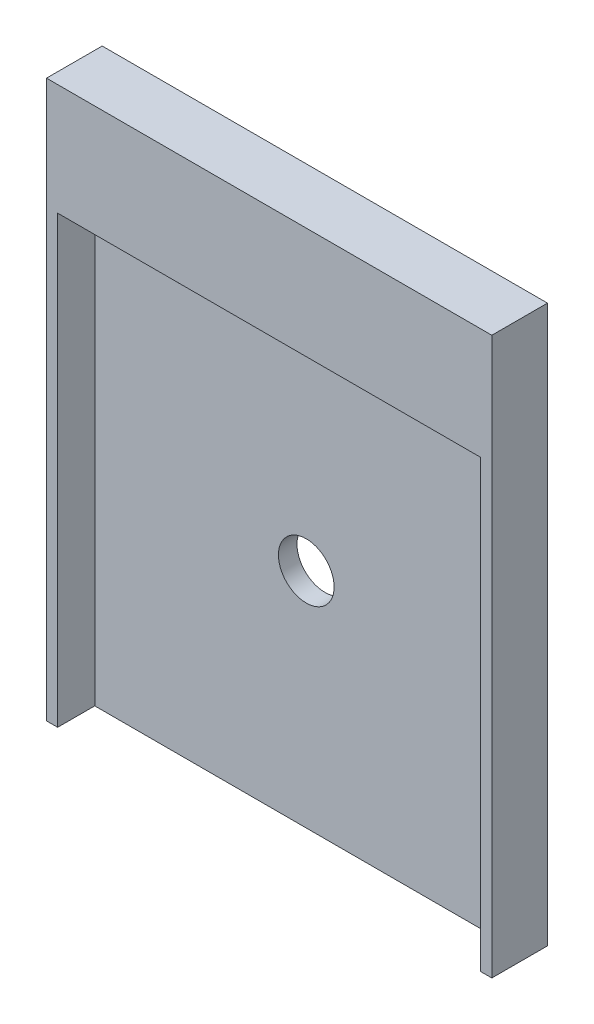
ISO-10303-21;
HEADER;
FILE_DESCRIPTION(('STEP AP214'),'2;1');
FILE_NAME('part.step','',(''),(''),'','','');
FILE_SCHEMA(('AUTOMOTIVE_DESIGN { 1 0 10303 214 1 1 1 1 }'));
ENDSEC;
DATA;
#1=APPLICATION_CONTEXT('core data for automotive mechanical design processes');
#2=APPLICATION_PROTOCOL_DEFINITION('international standard','automotive_design',2000,#1);
#3=PRODUCT_CONTEXT('',#1,'mechanical');
#4=PRODUCT('Part','Part','',(#3));
#5=PRODUCT_RELATED_PRODUCT_CATEGORY('part','',(#4));
#6=PRODUCT_DEFINITION_FORMATION('','',#4);
#7=PRODUCT_DEFINITION_CONTEXT('part definition',#1,'design');
#8=PRODUCT_DEFINITION('design','',#6,#7);
#9=PRODUCT_DEFINITION_SHAPE('','',#8);
#10=(LENGTH_UNIT() NAMED_UNIT(*) SI_UNIT(.MILLI.,.METRE.));
#11=(NAMED_UNIT(*) PLANE_ANGLE_UNIT() SI_UNIT($,.RADIAN.));
#12=(NAMED_UNIT(*) SI_UNIT($,.STERADIAN.) SOLID_ANGLE_UNIT());
#13=UNCERTAINTY_MEASURE_WITH_UNIT(LENGTH_MEASURE(1.E-05),#10,'distance_accuracy_value','');
#14=(GEOMETRIC_REPRESENTATION_CONTEXT(3) GLOBAL_UNCERTAINTY_ASSIGNED_CONTEXT((#13)) GLOBAL_UNIT_ASSIGNED_CONTEXT((#10,
#11,#12)) REPRESENTATION_CONTEXT('',''));
#15=CARTESIAN_POINT('',(0.,0.,0.));
#16=DIRECTION('',(0.,0.,1.));
#17=DIRECTION('',(1.,0.,0.));
#18=AXIS2_PLACEMENT_3D('',#15,#16,#17);
#19=CARTESIAN_POINT('',(60.,75.,5.));
#20=DIRECTION('',(-1.,0.,0.));
#21=DIRECTION('',(0.,-1.,0.));
#22=AXIS2_PLACEMENT_3D('',#19,#20,#21);
#23=PLANE('',#22);
#24=DIRECTION('',(0.,1.,0.));
#25=VECTOR('',#24,1.);
#26=CARTESIAN_POINT('',(60.,75.,0.));
#27=LINE('',#26,#25);
#28=CARTESIAN_POINT('',(60.,-75.,0.));
#29=VERTEX_POINT('',#28);
#30=CARTESIAN_POINT('',(60.,75.,0.));
#31=VERTEX_POINT('',#30);
#32=EDGE_CURVE('E163',#29,#31,#27,.T.);
#33=ORIENTED_EDGE('',*,*,#32,.T.);
#34=DIRECTION('',(0.,0.,-1.));
#35=VECTOR('',#34,1.);
#36=CARTESIAN_POINT('',(60.,75.,5.));
#37=LINE('',#36,#35);
#38=CARTESIAN_POINT('',(60.,75.,15.));
#39=VERTEX_POINT('',#38);
#40=EDGE_CURVE('E11',#39,#31,#37,.T.);
#41=ORIENTED_EDGE('',*,*,#40,.F.);
#42=DIRECTION('',(0.,1.,0.));
#43=VECTOR('',#42,1.);
#44=CARTESIAN_POINT('',(60.,45.,15.));
#45=LINE('',#44,#43);
#46=CARTESIAN_POINT('',(60.,-75.,15.));
#47=VERTEX_POINT('',#46);
#48=EDGE_CURVE('E136',#47,#39,#45,.T.);
#49=ORIENTED_EDGE('',*,*,#48,.F.);
#50=DIRECTION('',(0.,0.,-1.));
#51=VECTOR('',#50,1.);
#52=CARTESIAN_POINT('',(60.,-75.,5.));
#53=LINE('',#52,#51);
#54=EDGE_CURVE('E109',#47,#29,#53,.T.);
#55=ORIENTED_EDGE('',*,*,#54,.T.);
#56=EDGE_LOOP('',(#33,#41,#49,#55));
#57=FACE_BOUND('',#56,.T.);
#58=ADVANCED_FACE('F35',(#57),#23,.F.);
#59=CARTESIAN_POINT('',(-60.,75.,5.));
#60=DIRECTION('',(0.,-1.,0.));
#61=DIRECTION('',(0.,0.,-1.));
#62=AXIS2_PLACEMENT_3D('',#59,#60,#61);
#63=PLANE('',#62);
#64=DIRECTION('',(-1.,0.,0.));
#65=VECTOR('',#64,1.);
#66=CARTESIAN_POINT('',(-60.,75.,0.));
#67=LINE('',#66,#65);
#68=CARTESIAN_POINT('',(-60.,75.,0.));
#69=VERTEX_POINT('',#68);
#70=EDGE_CURVE('E195',#31,#69,#67,.T.);
#71=ORIENTED_EDGE('',*,*,#70,.T.);
#72=DIRECTION('',(0.,0.,-1.));
#73=VECTOR('',#72,1.);
#74=CARTESIAN_POINT('',(-60.,75.,5.));
#75=LINE('',#74,#73);
#76=CARTESIAN_POINT('',(-60.,75.,15.));
#77=VERTEX_POINT('',#76);
#78=EDGE_CURVE('E43',#77,#69,#75,.T.);
#79=ORIENTED_EDGE('',*,*,#78,.F.);
#80=DIRECTION('',(-1.,0.,0.));
#81=VECTOR('',#80,1.);
#82=CARTESIAN_POINT('',(-60.,75.,15.));
#83=LINE('',#82,#81);
#84=EDGE_CURVE('E118',#39,#77,#83,.T.);
#85=ORIENTED_EDGE('',*,*,#84,.F.);
#86=ORIENTED_EDGE('',*,*,#40,.T.);
#87=EDGE_LOOP('',(#71,#79,#85,#86));
#88=FACE_BOUND('',#87,.T.);
#89=ADVANCED_FACE('F202',(#88),#63,.F.);
#90=CARTESIAN_POINT('',(-60.,75.,5.));
#91=DIRECTION('',(1.,0.,0.));
#92=DIRECTION('',(0.,1.,0.));
#93=AXIS2_PLACEMENT_3D('',#90,#91,#92);
#94=PLANE('',#93);
#95=DIRECTION('',(0.,-1.,0.));
#96=VECTOR('',#95,1.);
#97=CARTESIAN_POINT('',(-60.,75.,0.));
#98=LINE('',#97,#96);
#99=CARTESIAN_POINT('',(-60.,-75.,0.));
#100=VERTEX_POINT('',#99);
#101=EDGE_CURVE('E105',#69,#100,#98,.T.);
#102=ORIENTED_EDGE('',*,*,#101,.T.);
#103=DIRECTION('',(0.,0.,-1.));
#104=VECTOR('',#103,1.);
#105=CARTESIAN_POINT('',(-60.,-75.,5.));
#106=LINE('',#105,#104);
#107=CARTESIAN_POINT('',(-60.,-75.,15.));
#108=VERTEX_POINT('',#107);
#109=EDGE_CURVE('E99',#108,#100,#106,.T.);
#110=ORIENTED_EDGE('',*,*,#109,.F.);
#111=DIRECTION('',(0.,-1.,0.));
#112=VECTOR('',#111,1.);
#113=CARTESIAN_POINT('',(-60.,75.,15.));
#114=LINE('',#113,#112);
#115=EDGE_CURVE('E103',#77,#108,#114,.T.);
#116=ORIENTED_EDGE('',*,*,#115,.F.);
#117=ORIENTED_EDGE('',*,*,#78,.T.);
#118=EDGE_LOOP('',(#102,#110,#116,#117));
#119=FACE_BOUND('',#118,.T.);
#120=ADVANCED_FACE('F101',(#119),#94,.F.);
#121=CARTESIAN_POINT('',(-60.,-75.,5.));
#122=DIRECTION('',(0.,1.,0.));
#123=DIRECTION('',(0.,0.,1.));
#124=AXIS2_PLACEMENT_3D('',#121,#122,#123);
#125=PLANE('',#124);
#126=DIRECTION('',(1.,0.,0.));
#127=VECTOR('',#126,1.);
#128=CARTESIAN_POINT('',(-60.,-75.,0.));
#129=LINE('',#128,#127);
#130=EDGE_CURVE('E170',#100,#29,#129,.T.);
#131=ORIENTED_EDGE('',*,*,#130,.T.);
#132=ORIENTED_EDGE('',*,*,#54,.F.);
#133=DIRECTION('',(1.,0.,0.));
#134=VECTOR('',#133,1.);
#135=CARTESIAN_POINT('',(60.,-75.,15.));
#136=LINE('',#135,#134);
#137=CARTESIAN_POINT('',(57.,-75.,15.));
#138=VERTEX_POINT('',#137);
#139=EDGE_CURVE('E133',#138,#47,#136,.T.);
#140=ORIENTED_EDGE('',*,*,#139,.F.);
#141=DIRECTION('',(0.,0.,-1.));
#142=VECTOR('',#141,1.);
#143=CARTESIAN_POINT('',(57.,-75.,15.));
#144=LINE('',#143,#142);
#145=CARTESIAN_POINT('',(57.,-75.,5.));
#146=VERTEX_POINT('',#145);
#147=EDGE_CURVE('E139',#138,#146,#144,.T.);
#148=ORIENTED_EDGE('',*,*,#147,.T.);
#149=DIRECTION('',(1.,0.,0.));
#150=VECTOR('',#149,1.);
#151=CARTESIAN_POINT('',(-60.,-75.,5.));
#152=LINE('',#151,#150);
#153=CARTESIAN_POINT('',(-57.,-75.,5.));
#154=VERTEX_POINT('',#153);
#155=EDGE_CURVE('E56',#154,#146,#152,.T.);
#156=ORIENTED_EDGE('',*,*,#155,.F.);
#157=DIRECTION('',(0.,0.,-1.));
#158=VECTOR('',#157,1.);
#159=CARTESIAN_POINT('',(-57.,-75.,15.));
#160=LINE('',#159,#158);
#161=CARTESIAN_POINT('',(-57.,-75.,15.));
#162=VERTEX_POINT('',#161);
#163=EDGE_CURVE('E122',#162,#154,#160,.T.);
#164=ORIENTED_EDGE('',*,*,#163,.F.);
#165=DIRECTION('',(1.,0.,0.));
#166=VECTOR('',#165,1.);
#167=CARTESIAN_POINT('',(-60.,-75.,15.));
#168=LINE('',#167,#166);
#169=EDGE_CURVE('E114',#108,#162,#168,.T.);
#170=ORIENTED_EDGE('',*,*,#169,.F.);
#171=ORIENTED_EDGE('',*,*,#109,.T.);
#172=EDGE_LOOP('',(#131,#132,#140,#148,#156,#164,#170,#171));
#173=FACE_BOUND('',#172,.T.);
#174=ADVANCED_FACE('F120',(#173),#125,.F.);
#175=CARTESIAN_POINT('',(0.,0.,5.));
#176=DIRECTION('',(0.,0.,1.));
#177=DIRECTION('',(1.,0.,0.));
#178=AXIS2_PLACEMENT_3D('',#175,#176,#177);
#179=PLANE('',#178);
#180=CARTESIAN_POINT('',(0.,-15.,5.));
#181=DIRECTION('',(0.,0.,1.));
#182=DIRECTION('',(1.,0.,0.));
#183=AXIS2_PLACEMENT_3D('',#180,#181,#182);
#184=CIRCLE('',#183,7.5);
#185=CARTESIAN_POINT('',(7.5,-15.,5.));
#186=VERTEX_POINT('',#185);
#187=EDGE_CURVE('E174',#186,#186,#184,.T.);
#188=ORIENTED_EDGE('',*,*,#187,.F.);
#189=EDGE_LOOP('',(#188));
#190=FACE_BOUND('',#189,.T.);
#191=DIRECTION('',(0.,-1.,0.));
#192=VECTOR('',#191,1.);
#193=CARTESIAN_POINT('',(57.,45.,5.));
#194=LINE('',#193,#192);
#195=CARTESIAN_POINT('',(57.,45.,5.));
#196=VERTEX_POINT('',#195);
#197=EDGE_CURVE('E51',#196,#146,#194,.T.);
#198=ORIENTED_EDGE('',*,*,#197,.F.);
#199=DIRECTION('',(1.,0.,0.));
#200=VECTOR('',#199,1.);
#201=CARTESIAN_POINT('',(-57.,45.,5.));
#202=LINE('',#201,#200);
#203=CARTESIAN_POINT('',(-57.,45.,5.));
#204=VERTEX_POINT('',#203);
#205=EDGE_CURVE('E140',#204,#196,#202,.T.);
#206=ORIENTED_EDGE('',*,*,#205,.F.);
#207=DIRECTION('',(0.,1.,0.));
#208=VECTOR('',#207,1.);
#209=CARTESIAN_POINT('',(-57.,45.,5.));
#210=LINE('',#209,#208);
#211=EDGE_CURVE('E142',#154,#204,#210,.T.);
#212=ORIENTED_EDGE('',*,*,#211,.F.);
#213=ORIENTED_EDGE('',*,*,#155,.T.);
#214=EDGE_LOOP('',(#198,#206,#212,#213));
#215=FACE_BOUND('',#214,.T.);
#216=ADVANCED_FACE('F191',(#190,#215),#179,.T.);
#217=CARTESIAN_POINT('',(0.,0.,0.));
#218=DIRECTION('',(0.,0.,1.));
#219=DIRECTION('',(1.,0.,0.));
#220=AXIS2_PLACEMENT_3D('',#217,#218,#219);
#221=PLANE('',#220);
#222=CARTESIAN_POINT('',(0.,-15.,0.));
#223=DIRECTION('',(0.,0.,-1.));
#224=DIRECTION('',(-1.,0.,0.));
#225=AXIS2_PLACEMENT_3D('',#222,#223,#224);
#226=CIRCLE('',#225,7.5);
#227=CARTESIAN_POINT('',(-7.5,-15.,0.));
#228=VERTEX_POINT('',#227);
#229=EDGE_CURVE('E178',#228,#228,#226,.T.);
#230=ORIENTED_EDGE('',*,*,#229,.F.);
#231=EDGE_LOOP('',(#230));
#232=FACE_BOUND('',#231,.T.);
#233=ORIENTED_EDGE('',*,*,#32,.F.);
#234=ORIENTED_EDGE('',*,*,#130,.F.);
#235=ORIENTED_EDGE('',*,*,#101,.F.);
#236=ORIENTED_EDGE('',*,*,#70,.F.);
#237=EDGE_LOOP('',(#233,#234,#235,#236));
#238=FACE_BOUND('',#237,.T.);
#239=ADVANCED_FACE('F187',(#232,#238),#221,.F.);
#240=CARTESIAN_POINT('',(-57.,45.,15.));
#241=DIRECTION('',(-1.,0.,0.));
#242=DIRECTION('',(0.,-1.,0.));
#243=AXIS2_PLACEMENT_3D('',#240,#241,#242);
#244=PLANE('',#243);
#245=ORIENTED_EDGE('',*,*,#211,.T.);
#246=DIRECTION('',(0.,0.,-1.));
#247=VECTOR('',#246,1.);
#248=CARTESIAN_POINT('',(-57.,45.,15.));
#249=LINE('',#248,#247);
#250=CARTESIAN_POINT('',(-57.,45.,15.));
#251=VERTEX_POINT('',#250);
#252=EDGE_CURVE('E155',#251,#204,#249,.T.);
#253=ORIENTED_EDGE('',*,*,#252,.F.);
#254=DIRECTION('',(0.,1.,0.));
#255=VECTOR('',#254,1.);
#256=CARTESIAN_POINT('',(-57.,45.,15.));
#257=LINE('',#256,#255);
#258=EDGE_CURVE('E124',#162,#251,#257,.T.);
#259=ORIENTED_EDGE('',*,*,#258,.F.);
#260=ORIENTED_EDGE('',*,*,#163,.T.);
#261=EDGE_LOOP('',(#245,#253,#259,#260));
#262=FACE_BOUND('',#261,.T.);
#263=ADVANCED_FACE('F190',(#262),#244,.F.);
#264=CARTESIAN_POINT('',(-57.,45.,15.));
#265=DIRECTION('',(0.,1.,0.));
#266=DIRECTION('',(0.,0.,1.));
#267=AXIS2_PLACEMENT_3D('',#264,#265,#266);
#268=PLANE('',#267);
#269=ORIENTED_EDGE('',*,*,#205,.T.);
#270=DIRECTION('',(0.,0.,-1.));
#271=VECTOR('',#270,1.);
#272=CARTESIAN_POINT('',(57.,45.,15.));
#273=LINE('',#272,#271);
#274=CARTESIAN_POINT('',(57.,45.,15.));
#275=VERTEX_POINT('',#274);
#276=EDGE_CURVE('E145',#275,#196,#273,.T.);
#277=ORIENTED_EDGE('',*,*,#276,.F.);
#278=DIRECTION('',(1.,0.,0.));
#279=VECTOR('',#278,1.);
#280=CARTESIAN_POINT('',(-57.,45.,15.));
#281=LINE('',#280,#279);
#282=EDGE_CURVE('E126',#251,#275,#281,.T.);
#283=ORIENTED_EDGE('',*,*,#282,.F.);
#284=ORIENTED_EDGE('',*,*,#252,.T.);
#285=EDGE_LOOP('',(#269,#277,#283,#284));
#286=FACE_BOUND('',#285,.T.);
#287=ADVANCED_FACE('F206',(#286),#268,.F.);
#288=CARTESIAN_POINT('',(57.,45.,15.));
#289=DIRECTION('',(1.,0.,0.));
#290=DIRECTION('',(0.,1.,0.));
#291=AXIS2_PLACEMENT_3D('',#288,#289,#290);
#292=PLANE('',#291);
#293=ORIENTED_EDGE('',*,*,#197,.T.);
#294=ORIENTED_EDGE('',*,*,#147,.F.);
#295=DIRECTION('',(0.,-1.,0.));
#296=VECTOR('',#295,1.);
#297=CARTESIAN_POINT('',(57.,45.,15.));
#298=LINE('',#297,#296);
#299=EDGE_CURVE('E131',#275,#138,#298,.T.);
#300=ORIENTED_EDGE('',*,*,#299,.F.);
#301=ORIENTED_EDGE('',*,*,#276,.T.);
#302=EDGE_LOOP('',(#293,#294,#300,#301));
#303=FACE_BOUND('',#302,.T.);
#304=ADVANCED_FACE('F204',(#303),#292,.F.);
#305=CARTESIAN_POINT('',(0.,0.,15.));
#306=DIRECTION('',(0.,0.,1.));
#307=DIRECTION('',(1.,0.,0.));
#308=AXIS2_PLACEMENT_3D('',#305,#306,#307);
#309=PLANE('',#308);
#310=ORIENTED_EDGE('',*,*,#115,.T.);
#311=ORIENTED_EDGE('',*,*,#169,.T.);
#312=ORIENTED_EDGE('',*,*,#258,.T.);
#313=ORIENTED_EDGE('',*,*,#282,.T.);
#314=ORIENTED_EDGE('',*,*,#299,.T.);
#315=ORIENTED_EDGE('',*,*,#139,.T.);
#316=ORIENTED_EDGE('',*,*,#48,.T.);
#317=ORIENTED_EDGE('',*,*,#84,.T.);
#318=EDGE_LOOP('',(#310,#311,#312,#313,#314,#315,#316,#317));
#319=FACE_BOUND('',#318,.T.);
#320=ADVANCED_FACE('F113',(#319),#309,.T.);
#321=CARTESIAN_POINT('',(0.,-15.,10.));
#322=DIRECTION('',(0.,0.,-1.));
#323=DIRECTION('',(-1.,0.,0.));
#324=AXIS2_PLACEMENT_3D('',#321,#322,#323);
#325=CYLINDRICAL_SURFACE('',#324,7.5);
#326=ORIENTED_EDGE('',*,*,#187,.T.);
#327=EDGE_LOOP('',(#326));
#328=FACE_BOUND('',#327,.T.);
#329=ORIENTED_EDGE('',*,*,#229,.T.);
#330=EDGE_LOOP('',(#329));
#331=FACE_BOUND('',#330,.T.);
#332=ADVANCED_FACE('F185',(#328,#331),#325,.F.);
#333=CLOSED_SHELL('',(#58,#89,#120,#174,#216,#239,#263,#287,#304,#320,#332));
#334=MANIFOLD_SOLID_BREP('B2',#333);
#335=ADVANCED_BREP_SHAPE_REPRESENTATION('',(#18,#334),#14);
#336=SHAPE_DEFINITION_REPRESENTATION(#9,#335);
ENDSEC;
END-ISO-10303-21;
